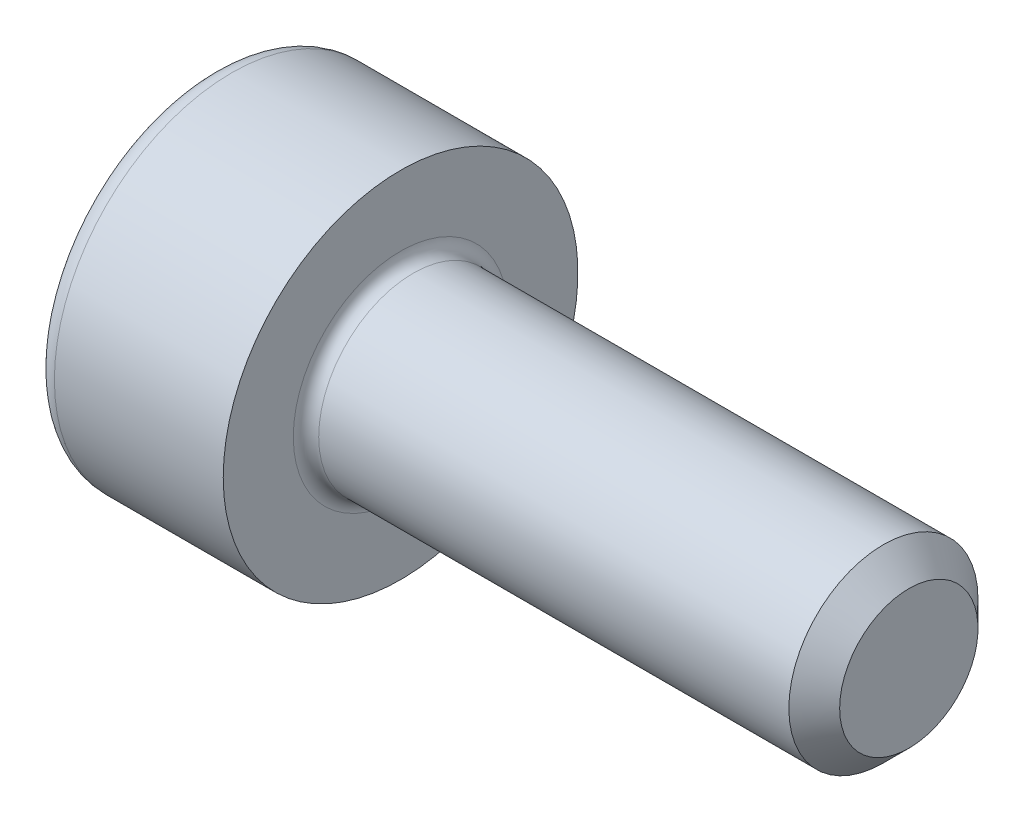
ISO-10303-21;
HEADER;
FILE_DESCRIPTION(('STEP AP214'),'2;1');
FILE_NAME('part.step','',(''),(''),'','','');
FILE_SCHEMA(('AUTOMOTIVE_DESIGN { 1 0 10303 214 1 1 1 1 }'));
ENDSEC;
DATA;
#1=APPLICATION_CONTEXT('core data for automotive mechanical design processes');
#2=APPLICATION_PROTOCOL_DEFINITION('international standard','automotive_design',2000,#1);
#3=PRODUCT_CONTEXT('',#1,'mechanical');
#4=PRODUCT('Part','Part','',(#3));
#5=PRODUCT_RELATED_PRODUCT_CATEGORY('part','',(#4));
#6=PRODUCT_DEFINITION_FORMATION('','',#4);
#7=PRODUCT_DEFINITION_CONTEXT('part definition',#1,'design');
#8=PRODUCT_DEFINITION('design','',#6,#7);
#9=PRODUCT_DEFINITION_SHAPE('','',#8);
#10=(LENGTH_UNIT() NAMED_UNIT(*) SI_UNIT(.MILLI.,.METRE.));
#11=(NAMED_UNIT(*) PLANE_ANGLE_UNIT() SI_UNIT($,.RADIAN.));
#12=(NAMED_UNIT(*) SI_UNIT($,.STERADIAN.) SOLID_ANGLE_UNIT());
#13=UNCERTAINTY_MEASURE_WITH_UNIT(LENGTH_MEASURE(1.E-05),#10,'distance_accuracy_value','');
#14=(GEOMETRIC_REPRESENTATION_CONTEXT(3) GLOBAL_UNCERTAINTY_ASSIGNED_CONTEXT((#13)) GLOBAL_UNIT_ASSIGNED_CONTEXT((#10,
#11,#12)) REPRESENTATION_CONTEXT('',''));
#15=CARTESIAN_POINT('',(0.,0.,0.));
#16=DIRECTION('',(0.,0.,1.));
#17=DIRECTION('',(1.,0.,0.));
#18=AXIS2_PLACEMENT_3D('',#15,#16,#17);
#19=CARTESIAN_POINT('',(0.,0.,0.));
#20=DIRECTION('',(-1.,0.,0.));
#21=DIRECTION('',(0.,0.,1.));
#22=AXIS2_PLACEMENT_3D('',#19,#20,#21);
#23=CYLINDRICAL_SURFACE('',#22,1.39568824458778);
#24=CARTESIAN_POINT('',(0.16,0.,0.));
#25=DIRECTION('',(1.,0.,0.));
#26=DIRECTION('',(0.,0.,-1.));
#27=AXIS2_PLACEMENT_3D('',#24,#25,#26);
#28=CIRCLE('',#27,1.39568824458778);
#29=CARTESIAN_POINT('',(0.16,0.,-1.39568824458778));
#30=VERTEX_POINT('',#29);
#31=EDGE_CURVE('E158',#30,#30,#28,.T.);
#32=ORIENTED_EDGE('',*,*,#31,.T.);
#33=EDGE_LOOP('',(#32));
#34=FACE_BOUND('',#33,.T.);
#35=CARTESIAN_POINT('',(1.48873412756029,0.,0.));
#36=DIRECTION('',(-1.,0.,0.));
#37=DIRECTION('',(0.,0.,1.));
#38=AXIS2_PLACEMENT_3D('',#35,#36,#37);
#39=CIRCLE('',#38,1.39568824458778);
#40=CARTESIAN_POINT('',(1.48873412756029,0.,1.39568824458778));
#41=VERTEX_POINT('',#40);
#42=EDGE_CURVE('E141',#41,#41,#39,.T.);
#43=ORIENTED_EDGE('',*,*,#42,.T.);
#44=EDGE_LOOP('',(#43));
#45=FACE_BOUND('',#44,.T.);
#46=ADVANCED_FACE('F39',(#34,#45),#23,.T.);
#47=CARTESIAN_POINT('',(0.,0.,0.));
#48=DIRECTION('',(1.,0.,0.));
#49=DIRECTION('',(0.,0.,-1.));
#50=AXIS2_PLACEMENT_3D('',#47,#48,#49);
#51=PLANE('',#50);
#52=DIRECTION('',(0.,-0.5,-0.866025403784439));
#53=VECTOR('',#52,1.);
#54=CARTESIAN_POINT('',(0.,0.877572409168232,0.));
#55=LINE('',#54,#53);
#56=CARTESIAN_POINT('',(0.,0.877572409168232,0.));
#57=VERTEX_POINT('',#56);
#58=CARTESIAN_POINT('',(0.,0.438786204584116,-0.760000000000001));
#59=VERTEX_POINT('',#58);
#60=EDGE_CURVE('E128',#57,#59,#55,.T.);
#61=ORIENTED_EDGE('',*,*,#60,.F.);
#62=DIRECTION('',(0.,0.5,-0.866025403784439));
#63=VECTOR('',#62,1.);
#64=CARTESIAN_POINT('',(0.,0.438786204584116,0.76));
#65=LINE('',#64,#63);
#66=CARTESIAN_POINT('',(0.,0.438786204584116,0.76));
#67=VERTEX_POINT('',#66);
#68=EDGE_CURVE('E54',#67,#57,#65,.T.);
#69=ORIENTED_EDGE('',*,*,#68,.F.);
#70=DIRECTION('',(0.,1.,0.));
#71=VECTOR('',#70,1.);
#72=CARTESIAN_POINT('',(0.,-0.438786204584116,0.76));
#73=LINE('',#72,#71);
#74=CARTESIAN_POINT('',(0.,-0.438786204584116,0.76));
#75=VERTEX_POINT('',#74);
#76=EDGE_CURVE('E137',#75,#67,#73,.T.);
#77=ORIENTED_EDGE('',*,*,#76,.F.);
#78=DIRECTION('',(0.,0.5,0.866025403784439));
#79=VECTOR('',#78,1.);
#80=CARTESIAN_POINT('',(0.,-0.877572409168232,0.));
#81=LINE('',#80,#79);
#82=CARTESIAN_POINT('',(0.,-0.877572409168232,0.));
#83=VERTEX_POINT('',#82);
#84=EDGE_CURVE('E135',#83,#75,#81,.T.);
#85=ORIENTED_EDGE('',*,*,#84,.F.);
#86=DIRECTION('',(0.,-0.5,0.866025403784438));
#87=VECTOR('',#86,1.);
#88=CARTESIAN_POINT('',(0.,-0.438786204584116,-0.760000000000001));
#89=LINE('',#88,#87);
#90=CARTESIAN_POINT('',(0.,-0.438786204584116,-0.760000000000001));
#91=VERTEX_POINT('',#90);
#92=EDGE_CURVE('E102',#91,#83,#89,.T.);
#93=ORIENTED_EDGE('',*,*,#92,.F.);
#94=DIRECTION('',(0.,-1.,0.));
#95=VECTOR('',#94,1.);
#96=CARTESIAN_POINT('',(0.,0.438786204584116,-0.760000000000001));
#97=LINE('',#96,#95);
#98=EDGE_CURVE('E131',#59,#91,#97,.T.);
#99=ORIENTED_EDGE('',*,*,#98,.F.);
#100=EDGE_LOOP('',(#61,#69,#77,#85,#93,#99));
#101=FACE_BOUND('',#100,.T.);
#102=CARTESIAN_POINT('',(0.,0.,0.));
#103=DIRECTION('',(1.,0.,0.));
#104=DIRECTION('',(0.,0.,-1.));
#105=AXIS2_PLACEMENT_3D('',#102,#103,#104);
#106=CIRCLE('',#105,1.23568824458778);
#107=CARTESIAN_POINT('',(0.,0.,-1.23568824458778));
#108=VERTEX_POINT('',#107);
#109=EDGE_CURVE('E155',#108,#108,#106,.F.);
#110=ORIENTED_EDGE('',*,*,#109,.T.);
#111=EDGE_LOOP('',(#110));
#112=FACE_BOUND('',#111,.T.);
#113=ADVANCED_FACE('F180',(#101,#112),#51,.F.);
#114=CARTESIAN_POINT('',(5.48873412756029,0.,0.));
#115=DIRECTION('',(-1.,0.,0.));
#116=DIRECTION('',(0.,0.,1.));
#117=AXIS2_PLACEMENT_3D('',#114,#115,#116);
#118=PLANE('',#117);
#119=CARTESIAN_POINT('',(5.48873412756029,0.,0.));
#120=DIRECTION('',(-1.,0.,0.));
#121=DIRECTION('',(0.,0.,1.));
#122=AXIS2_PLACEMENT_3D('',#119,#120,#121);
#123=CIRCLE('',#122,0.544367063780146);
#124=CARTESIAN_POINT('',(5.48873412756029,0.,0.544367063780146));
#125=VERTEX_POINT('',#124);
#126=EDGE_CURVE('E11',#125,#125,#123,.F.);
#127=ORIENTED_EDGE('',*,*,#126,.T.);
#128=EDGE_LOOP('',(#127));
#129=FACE_BOUND('',#128,.T.);
#130=ADVANCED_FACE('F186',(#129),#118,.F.);
#131=CARTESIAN_POINT('',(0.,0.,0.));
#132=DIRECTION('',(-1.,0.,0.));
#133=DIRECTION('',(0.,0.,1.));
#134=AXIS2_PLACEMENT_3D('',#131,#132,#133);
#135=CYLINDRICAL_SURFACE('',#134,0.744367063780146);
#136=CARTESIAN_POINT('',(5.2887341275603,0.,0.));
#137=DIRECTION('',(-1.,0.,0.));
#138=DIRECTION('',(0.,0.,1.));
#139=AXIS2_PLACEMENT_3D('',#136,#137,#138);
#140=CIRCLE('',#139,0.744367063780146);
#141=CARTESIAN_POINT('',(5.2887341275603,0.,0.744367063780146));
#142=VERTEX_POINT('',#141);
#143=EDGE_CURVE('E47',#142,#142,#140,.T.);
#144=ORIENTED_EDGE('',*,*,#143,.T.);
#145=EDGE_LOOP('',(#144));
#146=FACE_BOUND('',#145,.T.);
#147=CARTESIAN_POINT('',(1.58873412756029,0.,0.));
#148=DIRECTION('',(-1.,0.,0.));
#149=DIRECTION('',(0.,0.,1.));
#150=AXIS2_PLACEMENT_3D('',#147,#148,#149);
#151=CIRCLE('',#150,0.744367063780146);
#152=CARTESIAN_POINT('',(1.58873412756029,0.,0.744367063780146));
#153=VERTEX_POINT('',#152);
#154=EDGE_CURVE('E152',#153,#153,#151,.F.);
#155=ORIENTED_EDGE('',*,*,#154,.T.);
#156=EDGE_LOOP('',(#155));
#157=FACE_BOUND('',#156,.T.);
#158=ADVANCED_FACE('F163',(#146,#157),#135,.T.);
#159=CARTESIAN_POINT('',(1.48873412756029,0.,0.));
#160=DIRECTION('',(-1.,0.,0.));
#161=DIRECTION('',(0.,0.,1.));
#162=AXIS2_PLACEMENT_3D('',#159,#160,#161);
#163=PLANE('',#162);
#164=CARTESIAN_POINT('',(1.48873412756029,0.,0.));
#165=DIRECTION('',(-1.,0.,0.));
#166=DIRECTION('',(0.,0.,1.));
#167=AXIS2_PLACEMENT_3D('',#164,#165,#166);
#168=CIRCLE('',#167,0.844367063780146);
#169=CARTESIAN_POINT('',(1.48873412756029,0.,0.844367063780146));
#170=VERTEX_POINT('',#169);
#171=EDGE_CURVE('E149',#170,#170,#168,.T.);
#172=ORIENTED_EDGE('',*,*,#171,.T.);
#173=EDGE_LOOP('',(#172));
#174=FACE_BOUND('',#173,.T.);
#175=ORIENTED_EDGE('',*,*,#42,.F.);
#176=EDGE_LOOP('',(#175));
#177=FACE_BOUND('',#176,.T.);
#178=ADVANCED_FACE('F193',(#174,#177),#163,.F.);
#179=CARTESIAN_POINT('',(1.58873412756029,0.,0.));
#180=DIRECTION('',(-1.,0.,0.));
#181=DIRECTION('',(0.,0.,1.));
#182=AXIS2_PLACEMENT_3D('',#179,#180,#181);
#183=TOROIDAL_SURFACE('',#182,0.844367063780146,0.1);
#184=ORIENTED_EDGE('',*,*,#154,.F.);
#185=EDGE_LOOP('',(#184));
#186=FACE_BOUND('',#185,.T.);
#187=ORIENTED_EDGE('',*,*,#171,.F.);
#188=EDGE_LOOP('',(#187));
#189=FACE_BOUND('',#188,.T.);
#190=ADVANCED_FACE('F176',(#186,#189),#183,.F.);
#191=CARTESIAN_POINT('',(0.16,0.,0.));
#192=DIRECTION('',(1.,0.,0.));
#193=DIRECTION('',(0.,0.,-1.));
#194=AXIS2_PLACEMENT_3D('',#191,#192,#193);
#195=TOROIDAL_SURFACE('',#194,1.23568824458778,0.16);
#196=ORIENTED_EDGE('',*,*,#31,.F.);
#197=EDGE_LOOP('',(#196));
#198=FACE_BOUND('',#197,.T.);
#199=ORIENTED_EDGE('',*,*,#109,.F.);
#200=EDGE_LOOP('',(#199));
#201=FACE_BOUND('',#200,.T.);
#202=ADVANCED_FACE('F168',(#198,#201),#195,.T.);
#203=CARTESIAN_POINT('',(5.2887341275603,0.,0.));
#204=DIRECTION('',(-1.,0.,0.));
#205=DIRECTION('',(0.,0.,1.));
#206=AXIS2_PLACEMENT_3D('',#203,#204,#205);
#207=CONICAL_SURFACE('',#206,0.744367063780146,0.785398163397451);
#208=ORIENTED_EDGE('',*,*,#126,.F.);
#209=EDGE_LOOP('',(#208));
#210=FACE_BOUND('',#209,.T.);
#211=ORIENTED_EDGE('',*,*,#143,.F.);
#212=EDGE_LOOP('',(#211));
#213=FACE_BOUND('',#212,.T.);
#214=ADVANCED_FACE('F41',(#210,#213),#207,.T.);
#215=CARTESIAN_POINT('',(0.7,0.438786204584116,0.76));
#216=DIRECTION('',(0.,0.866025403784439,0.5));
#217=DIRECTION('',(0.,-0.5,0.866025403784439));
#218=AXIS2_PLACEMENT_3D('',#215,#216,#217);
#219=PLANE('',#218);
#220=ORIENTED_EDGE('',*,*,#68,.T.);
#221=DIRECTION('',(-1.,0.,0.));
#222=VECTOR('',#221,1.);
#223=CARTESIAN_POINT('',(0.7,0.877572409168232,0.));
#224=LINE('',#223,#222);
#225=CARTESIAN_POINT('',(0.7,0.877572409168232,0.));
#226=VERTEX_POINT('',#225);
#227=EDGE_CURVE('E84',#226,#57,#224,.T.);
#228=ORIENTED_EDGE('',*,*,#227,.F.);
#229=DIRECTION('',(0.,0.5,-0.866025403784439));
#230=VECTOR('',#229,1.);
#231=CARTESIAN_POINT('',(0.7,0.438786204584116,0.76));
#232=LINE('',#231,#230);
#233=CARTESIAN_POINT('',(0.7,0.438786204584116,0.76));
#234=VERTEX_POINT('',#233);
#235=EDGE_CURVE('E139',#234,#226,#232,.T.);
#236=ORIENTED_EDGE('',*,*,#235,.F.);
#237=DIRECTION('',(-1.,0.,0.));
#238=VECTOR('',#237,1.);
#239=CARTESIAN_POINT('',(0.7,0.438786204584116,0.76));
#240=LINE('',#239,#238);
#241=EDGE_CURVE('E62',#234,#67,#240,.T.);
#242=ORIENTED_EDGE('',*,*,#241,.T.);
#243=EDGE_LOOP('',(#220,#228,#236,#242));
#244=FACE_BOUND('',#243,.T.);
#245=ADVANCED_FACE('F167',(#244),#219,.F.);
#246=CARTESIAN_POINT('',(0.7,-0.438786204584116,0.76));
#247=DIRECTION('',(0.,0.,1.));
#248=DIRECTION('',(1.,0.,0.));
#249=AXIS2_PLACEMENT_3D('',#246,#247,#248);
#250=PLANE('',#249);
#251=ORIENTED_EDGE('',*,*,#76,.T.);
#252=ORIENTED_EDGE('',*,*,#241,.F.);
#253=DIRECTION('',(0.,1.,0.));
#254=VECTOR('',#253,1.);
#255=CARTESIAN_POINT('',(0.7,-0.438786204584116,0.76));
#256=LINE('',#255,#254);
#257=CARTESIAN_POINT('',(0.7,-0.438786204584116,0.76));
#258=VERTEX_POINT('',#257);
#259=EDGE_CURVE('E114',#258,#234,#256,.T.);
#260=ORIENTED_EDGE('',*,*,#259,.F.);
#261=DIRECTION('',(-1.,0.,0.));
#262=VECTOR('',#261,1.);
#263=CARTESIAN_POINT('',(0.7,-0.438786204584116,0.76));
#264=LINE('',#263,#262);
#265=EDGE_CURVE('E106',#258,#75,#264,.T.);
#266=ORIENTED_EDGE('',*,*,#265,.T.);
#267=EDGE_LOOP('',(#251,#252,#260,#266));
#268=FACE_BOUND('',#267,.T.);
#269=ADVANCED_FACE('F174',(#268),#250,.F.);
#270=CARTESIAN_POINT('',(0.7,-0.877572409168232,0.));
#271=DIRECTION('',(0.,-0.866025403784439,0.5));
#272=DIRECTION('',(0.,-0.5,-0.866025403784439));
#273=AXIS2_PLACEMENT_3D('',#270,#271,#272);
#274=PLANE('',#273);
#275=ORIENTED_EDGE('',*,*,#84,.T.);
#276=ORIENTED_EDGE('',*,*,#265,.F.);
#277=DIRECTION('',(0.,0.5,0.866025403784439));
#278=VECTOR('',#277,1.);
#279=CARTESIAN_POINT('',(0.7,-0.877572409168232,0.));
#280=LINE('',#279,#278);
#281=CARTESIAN_POINT('',(0.7,-0.877572409168232,0.));
#282=VERTEX_POINT('',#281);
#283=EDGE_CURVE('E110',#282,#258,#280,.T.);
#284=ORIENTED_EDGE('',*,*,#283,.F.);
#285=DIRECTION('',(-1.,0.,0.));
#286=VECTOR('',#285,1.);
#287=CARTESIAN_POINT('',(0.7,-0.877572409168232,0.));
#288=LINE('',#287,#286);
#289=EDGE_CURVE('E95',#282,#83,#288,.T.);
#290=ORIENTED_EDGE('',*,*,#289,.T.);
#291=EDGE_LOOP('',(#275,#276,#284,#290));
#292=FACE_BOUND('',#291,.T.);
#293=ADVANCED_FACE('F111',(#292),#274,.F.);
#294=CARTESIAN_POINT('',(0.7,-0.438786204584116,-0.760000000000001));
#295=DIRECTION('',(0.,-0.866025403784438,-0.5));
#296=DIRECTION('',(0.,0.5,-0.866025403784438));
#297=AXIS2_PLACEMENT_3D('',#294,#295,#296);
#298=PLANE('',#297);
#299=ORIENTED_EDGE('',*,*,#92,.T.);
#300=ORIENTED_EDGE('',*,*,#289,.F.);
#301=DIRECTION('',(0.,-0.5,0.866025403784438));
#302=VECTOR('',#301,1.);
#303=CARTESIAN_POINT('',(0.7,-0.438786204584116,-0.760000000000001));
#304=LINE('',#303,#302);
#305=CARTESIAN_POINT('',(0.7,-0.438786204584116,-0.760000000000001));
#306=VERTEX_POINT('',#305);
#307=EDGE_CURVE('E99',#306,#282,#304,.T.);
#308=ORIENTED_EDGE('',*,*,#307,.F.);
#309=DIRECTION('',(-1.,0.,0.));
#310=VECTOR('',#309,1.);
#311=CARTESIAN_POINT('',(0.7,-0.438786204584116,-0.760000000000001));
#312=LINE('',#311,#310);
#313=EDGE_CURVE('E107',#306,#91,#312,.T.);
#314=ORIENTED_EDGE('',*,*,#313,.T.);
#315=EDGE_LOOP('',(#299,#300,#308,#314));
#316=FACE_BOUND('',#315,.T.);
#317=ADVANCED_FACE('F97',(#316),#298,.F.);
#318=CARTESIAN_POINT('',(0.7,0.438786204584116,-0.760000000000001));
#319=DIRECTION('',(0.,0.,-1.));
#320=DIRECTION('',(0.,1.,0.));
#321=AXIS2_PLACEMENT_3D('',#318,#319,#320);
#322=PLANE('',#321);
#323=ORIENTED_EDGE('',*,*,#98,.T.);
#324=ORIENTED_EDGE('',*,*,#313,.F.);
#325=DIRECTION('',(0.,-1.,0.));
#326=VECTOR('',#325,1.);
#327=CARTESIAN_POINT('',(0.7,0.438786204584116,-0.760000000000001));
#328=LINE('',#327,#326);
#329=CARTESIAN_POINT('',(0.7,0.438786204584116,-0.760000000000001));
#330=VERTEX_POINT('',#329);
#331=EDGE_CURVE('E120',#330,#306,#328,.T.);
#332=ORIENTED_EDGE('',*,*,#331,.F.);
#333=DIRECTION('',(-1.,0.,0.));
#334=VECTOR('',#333,1.);
#335=CARTESIAN_POINT('',(0.7,0.438786204584116,-0.760000000000001));
#336=LINE('',#335,#334);
#337=EDGE_CURVE('E144',#330,#59,#336,.T.);
#338=ORIENTED_EDGE('',*,*,#337,.T.);
#339=EDGE_LOOP('',(#323,#324,#332,#338));
#340=FACE_BOUND('',#339,.T.);
#341=ADVANCED_FACE('F215',(#340),#322,.F.);
#342=CARTESIAN_POINT('',(0.7,0.877572409168232,0.));
#343=DIRECTION('',(0.,0.866025403784439,-0.5));
#344=DIRECTION('',(0.,0.5,0.866025403784439));
#345=AXIS2_PLACEMENT_3D('',#342,#343,#344);
#346=PLANE('',#345);
#347=ORIENTED_EDGE('',*,*,#60,.T.);
#348=ORIENTED_EDGE('',*,*,#337,.F.);
#349=DIRECTION('',(0.,-0.5,-0.866025403784439));
#350=VECTOR('',#349,1.);
#351=CARTESIAN_POINT('',(0.7,0.877572409168232,0.));
#352=LINE('',#351,#350);
#353=EDGE_CURVE('E122',#226,#330,#352,.T.);
#354=ORIENTED_EDGE('',*,*,#353,.F.);
#355=ORIENTED_EDGE('',*,*,#227,.T.);
#356=EDGE_LOOP('',(#347,#348,#354,#355));
#357=FACE_BOUND('',#356,.T.);
#358=ADVANCED_FACE('F212',(#357),#346,.F.);
#359=CARTESIAN_POINT('',(0.7,0.,0.));
#360=DIRECTION('',(-1.,0.,0.));
#361=DIRECTION('',(0.,0.,1.));
#362=AXIS2_PLACEMENT_3D('',#359,#360,#361);
#363=PLANE('',#362);
#364=ORIENTED_EDGE('',*,*,#235,.T.);
#365=ORIENTED_EDGE('',*,*,#353,.T.);
#366=ORIENTED_EDGE('',*,*,#331,.T.);
#367=ORIENTED_EDGE('',*,*,#307,.T.);
#368=ORIENTED_EDGE('',*,*,#283,.T.);
#369=ORIENTED_EDGE('',*,*,#259,.T.);
#370=EDGE_LOOP('',(#364,#365,#366,#367,#368,#369));
#371=FACE_BOUND('',#370,.T.);
#372=ADVANCED_FACE('F117',(#371),#363,.T.);
#373=CLOSED_SHELL('',(#46,#113,#130,#158,#178,#190,#202,#214,#245,#269,#293,#317,#341,#358,#372));
#374=MANIFOLD_SOLID_BREP('B2',#373);
#375=ADVANCED_BREP_SHAPE_REPRESENTATION('',(#18,#374),#14);
#376=SHAPE_DEFINITION_REPRESENTATION(#9,#375);
ENDSEC;
END-ISO-10303-21;
